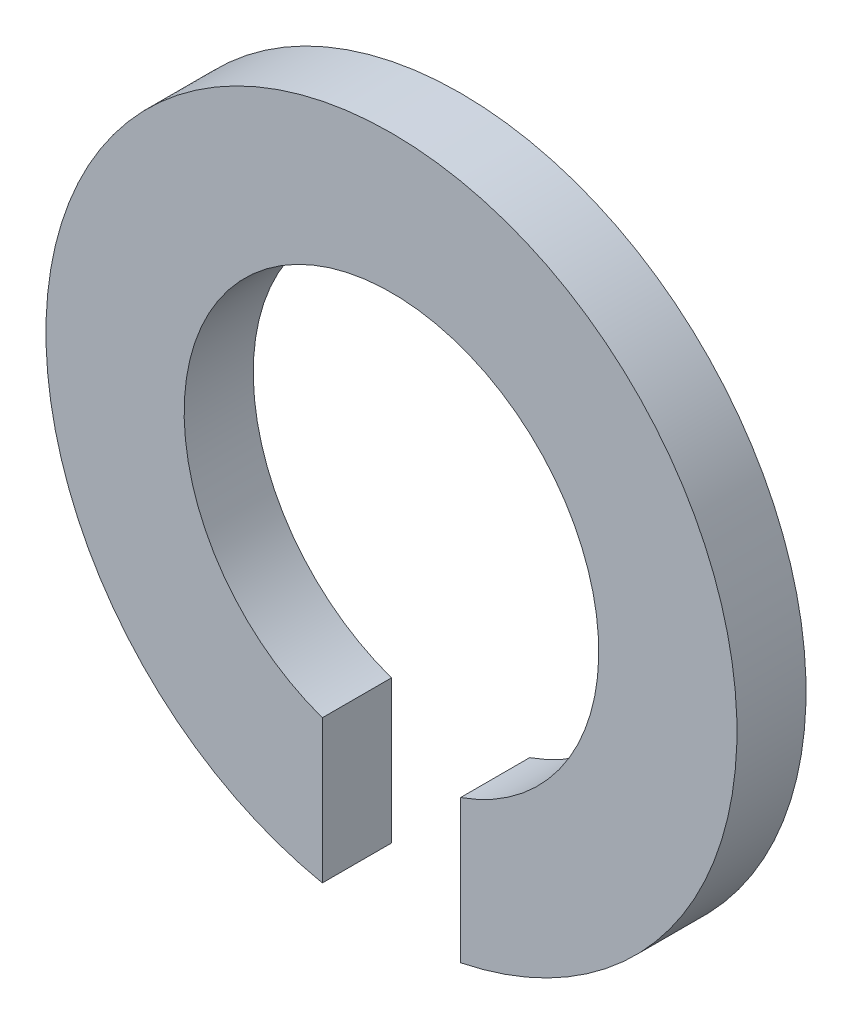
ISO-10303-21;
HEADER;
FILE_DESCRIPTION(('STEP AP214'),'2;1');
FILE_NAME('part.step','',(''),(''),'','','');
FILE_SCHEMA(('AUTOMOTIVE_DESIGN { 1 0 10303 214 1 1 1 1 }'));
ENDSEC;
DATA;
#1=APPLICATION_CONTEXT('core data for automotive mechanical design processes');
#2=APPLICATION_PROTOCOL_DEFINITION('international standard','automotive_design',2000,#1);
#3=PRODUCT_CONTEXT('',#1,'mechanical');
#4=PRODUCT('Part','Part','',(#3));
#5=PRODUCT_RELATED_PRODUCT_CATEGORY('part','',(#4));
#6=PRODUCT_DEFINITION_FORMATION('','',#4);
#7=PRODUCT_DEFINITION_CONTEXT('part definition',#1,'design');
#8=PRODUCT_DEFINITION('design','',#6,#7);
#9=PRODUCT_DEFINITION_SHAPE('','',#8);
#10=(LENGTH_UNIT() NAMED_UNIT(*) SI_UNIT(.MILLI.,.METRE.));
#11=(NAMED_UNIT(*) PLANE_ANGLE_UNIT() SI_UNIT($,.RADIAN.));
#12=(NAMED_UNIT(*) SI_UNIT($,.STERADIAN.) SOLID_ANGLE_UNIT());
#13=UNCERTAINTY_MEASURE_WITH_UNIT(LENGTH_MEASURE(1.E-05),#10,'distance_accuracy_value','');
#14=(GEOMETRIC_REPRESENTATION_CONTEXT(3) GLOBAL_UNCERTAINTY_ASSIGNED_CONTEXT((#13)) GLOBAL_UNIT_ASSIGNED_CONTEXT((#10,
#11,#12)) REPRESENTATION_CONTEXT('',''));
#15=CARTESIAN_POINT('',(0.,0.,0.));
#16=DIRECTION('',(0.,0.,1.));
#17=DIRECTION('',(1.,0.,0.));
#18=AXIS2_PLACEMENT_3D('',#15,#16,#17);
#19=CARTESIAN_POINT('',(0.,0.,0.5));
#20=DIRECTION('',(0.,0.,-1.));
#21=DIRECTION('',(-1.,0.,0.));
#22=AXIS2_PLACEMENT_3D('',#19,#20,#21);
#23=CYLINDRICAL_SURFACE('',#22,2.5);
#24=CARTESIAN_POINT('',(0.,0.,0.));
#25=DIRECTION('',(0.,0.,1.));
#26=DIRECTION('',(1.,0.,0.));
#27=AXIS2_PLACEMENT_3D('',#24,#25,#26);
#28=CIRCLE('',#27,2.5);
#29=CARTESIAN_POINT('',(0.5,-2.44948974278318,0.));
#30=VERTEX_POINT('',#29);
#31=CARTESIAN_POINT('',(-0.499999999999999,-2.44948974278318,0.));
#32=VERTEX_POINT('',#31);
#33=EDGE_CURVE('E113',#30,#32,#28,.T.);
#34=ORIENTED_EDGE('',*,*,#33,.T.);
#35=DIRECTION('',(0.,0.,-1.));
#36=VECTOR('',#35,1.);
#37=CARTESIAN_POINT('',(-0.499999999999999,-2.44948974278318,0.5));
#38=LINE('',#37,#36);
#39=CARTESIAN_POINT('',(-0.499999999999999,-2.44948974278318,0.5));
#40=VERTEX_POINT('',#39);
#41=EDGE_CURVE('E11',#40,#32,#38,.T.);
#42=ORIENTED_EDGE('',*,*,#41,.F.);
#43=CARTESIAN_POINT('',(0.,0.,0.5));
#44=DIRECTION('',(0.,0.,1.));
#45=DIRECTION('',(1.,0.,0.));
#46=AXIS2_PLACEMENT_3D('',#43,#44,#45);
#47=CIRCLE('',#46,2.5);
#48=CARTESIAN_POINT('',(0.5,-2.44948974278318,0.5));
#49=VERTEX_POINT('',#48);
#50=EDGE_CURVE('E97',#49,#40,#47,.T.);
#51=ORIENTED_EDGE('',*,*,#50,.F.);
#52=DIRECTION('',(0.,0.,-1.));
#53=VECTOR('',#52,1.);
#54=CARTESIAN_POINT('',(0.5,-2.44948974278318,0.5));
#55=LINE('',#54,#53);
#56=EDGE_CURVE('E109',#49,#30,#55,.T.);
#57=ORIENTED_EDGE('',*,*,#56,.T.);
#58=EDGE_LOOP('',(#34,#42,#51,#57));
#59=FACE_BOUND('',#58,.T.);
#60=ADVANCED_FACE('F45',(#59),#23,.T.);
#61=CARTESIAN_POINT('',(-0.499999999999999,-2.44948974278318,0.5));
#62=DIRECTION('',(-1.,0.,0.));
#63=DIRECTION('',(0.,0.,1.));
#64=AXIS2_PLACEMENT_3D('',#61,#62,#63);
#65=PLANE('',#64);
#66=DIRECTION('',(0.,1.,0.));
#67=VECTOR('',#66,1.);
#68=CARTESIAN_POINT('',(-0.499999999999999,-2.44948974278318,0.));
#69=LINE('',#68,#67);
#70=CARTESIAN_POINT('',(-0.499999999999999,-1.4142135623731,0.));
#71=VERTEX_POINT('',#70);
#72=EDGE_CURVE('E102',#32,#71,#69,.T.);
#73=ORIENTED_EDGE('',*,*,#72,.T.);
#74=DIRECTION('',(0.,0.,-1.));
#75=VECTOR('',#74,1.);
#76=CARTESIAN_POINT('',(-0.499999999999999,-1.4142135623731,0.5));
#77=LINE('',#76,#75);
#78=CARTESIAN_POINT('',(-0.499999999999999,-1.4142135623731,0.5));
#79=VERTEX_POINT('',#78);
#80=EDGE_CURVE('E54',#79,#71,#77,.T.);
#81=ORIENTED_EDGE('',*,*,#80,.F.);
#82=DIRECTION('',(0.,1.,0.));
#83=VECTOR('',#82,1.);
#84=CARTESIAN_POINT('',(-0.499999999999999,-2.44948974278318,0.5));
#85=LINE('',#84,#83);
#86=EDGE_CURVE('E92',#40,#79,#85,.T.);
#87=ORIENTED_EDGE('',*,*,#86,.F.);
#88=ORIENTED_EDGE('',*,*,#41,.T.);
#89=EDGE_LOOP('',(#73,#81,#87,#88));
#90=FACE_BOUND('',#89,.T.);
#91=ADVANCED_FACE('F101',(#90),#65,.F.);
#92=CARTESIAN_POINT('',(0.,0.,0.5));
#93=DIRECTION('',(0.,0.,-1.));
#94=DIRECTION('',(-1.,0.,0.));
#95=AXIS2_PLACEMENT_3D('',#92,#93,#94);
#96=CYLINDRICAL_SURFACE('',#95,1.5);
#97=CARTESIAN_POINT('',(0.,0.,0.));
#98=DIRECTION('',(0.,0.,-1.));
#99=DIRECTION('',(1.,0.,0.));
#100=AXIS2_PLACEMENT_3D('',#97,#98,#99);
#101=CIRCLE('',#100,1.5);
#102=CARTESIAN_POINT('',(0.499999999999999,-1.41421356237309,0.));
#103=VERTEX_POINT('',#102);
#104=EDGE_CURVE('E79',#71,#103,#101,.T.);
#105=ORIENTED_EDGE('',*,*,#104,.T.);
#106=DIRECTION('',(0.,0.,-1.));
#107=VECTOR('',#106,1.);
#108=CARTESIAN_POINT('',(0.499999999999999,-1.41421356237309,0.5));
#109=LINE('',#108,#107);
#110=CARTESIAN_POINT('',(0.499999999999999,-1.41421356237309,0.5));
#111=VERTEX_POINT('',#110);
#112=EDGE_CURVE('E104',#111,#103,#109,.T.);
#113=ORIENTED_EDGE('',*,*,#112,.F.);
#114=CARTESIAN_POINT('',(0.,0.,0.5));
#115=DIRECTION('',(0.,0.,-1.));
#116=DIRECTION('',(1.,0.,0.));
#117=AXIS2_PLACEMENT_3D('',#114,#115,#116);
#118=CIRCLE('',#117,1.5);
#119=EDGE_CURVE('E95',#79,#111,#118,.T.);
#120=ORIENTED_EDGE('',*,*,#119,.F.);
#121=ORIENTED_EDGE('',*,*,#80,.T.);
#122=EDGE_LOOP('',(#105,#113,#120,#121));
#123=FACE_BOUND('',#122,.T.);
#124=ADVANCED_FACE('F105',(#123),#96,.F.);
#125=CARTESIAN_POINT('',(0.5,-2.44948974278318,0.5));
#126=DIRECTION('',(1.,0.,0.));
#127=DIRECTION('',(0.,1.,0.));
#128=AXIS2_PLACEMENT_3D('',#125,#126,#127);
#129=PLANE('',#128);
#130=DIRECTION('',(0.,-1.,0.));
#131=VECTOR('',#130,1.);
#132=CARTESIAN_POINT('',(0.5,-2.44948974278318,0.));
#133=LINE('',#132,#131);
#134=EDGE_CURVE('E85',#103,#30,#133,.T.);
#135=ORIENTED_EDGE('',*,*,#134,.T.);
#136=ORIENTED_EDGE('',*,*,#56,.F.);
#137=DIRECTION('',(0.,-1.,0.));
#138=VECTOR('',#137,1.);
#139=CARTESIAN_POINT('',(0.5,-2.44948974278318,0.5));
#140=LINE('',#139,#138);
#141=EDGE_CURVE('E62',#111,#49,#140,.T.);
#142=ORIENTED_EDGE('',*,*,#141,.F.);
#143=ORIENTED_EDGE('',*,*,#112,.T.);
#144=EDGE_LOOP('',(#135,#136,#142,#143));
#145=FACE_BOUND('',#144,.T.);
#146=ADVANCED_FACE('F126',(#145),#129,.F.);
#147=CARTESIAN_POINT('',(0.,0.,0.5));
#148=DIRECTION('',(0.,0.,1.));
#149=DIRECTION('',(1.,0.,0.));
#150=AXIS2_PLACEMENT_3D('',#147,#148,#149);
#151=PLANE('',#150);
#152=ORIENTED_EDGE('',*,*,#50,.T.);
#153=ORIENTED_EDGE('',*,*,#86,.T.);
#154=ORIENTED_EDGE('',*,*,#119,.T.);
#155=ORIENTED_EDGE('',*,*,#141,.T.);
#156=EDGE_LOOP('',(#152,#153,#154,#155));
#157=FACE_BOUND('',#156,.T.);
#158=ADVANCED_FACE('F93',(#157),#151,.T.);
#159=CARTESIAN_POINT('',(0.,0.,0.));
#160=DIRECTION('',(0.,0.,1.));
#161=DIRECTION('',(1.,0.,0.));
#162=AXIS2_PLACEMENT_3D('',#159,#160,#161);
#163=PLANE('',#162);
#164=ORIENTED_EDGE('',*,*,#33,.F.);
#165=ORIENTED_EDGE('',*,*,#134,.F.);
#166=ORIENTED_EDGE('',*,*,#104,.F.);
#167=ORIENTED_EDGE('',*,*,#72,.F.);
#168=EDGE_LOOP('',(#164,#165,#166,#167));
#169=FACE_BOUND('',#168,.T.);
#170=ADVANCED_FACE('F129',(#169),#163,.F.);
#171=CLOSED_SHELL('',(#60,#91,#124,#146,#158,#170));
#172=MANIFOLD_SOLID_BREP('B2',#171);
#173=ADVANCED_BREP_SHAPE_REPRESENTATION('',(#18,#172),#14);
#174=SHAPE_DEFINITION_REPRESENTATION(#9,#173);
ENDSEC;
END-ISO-10303-21;
